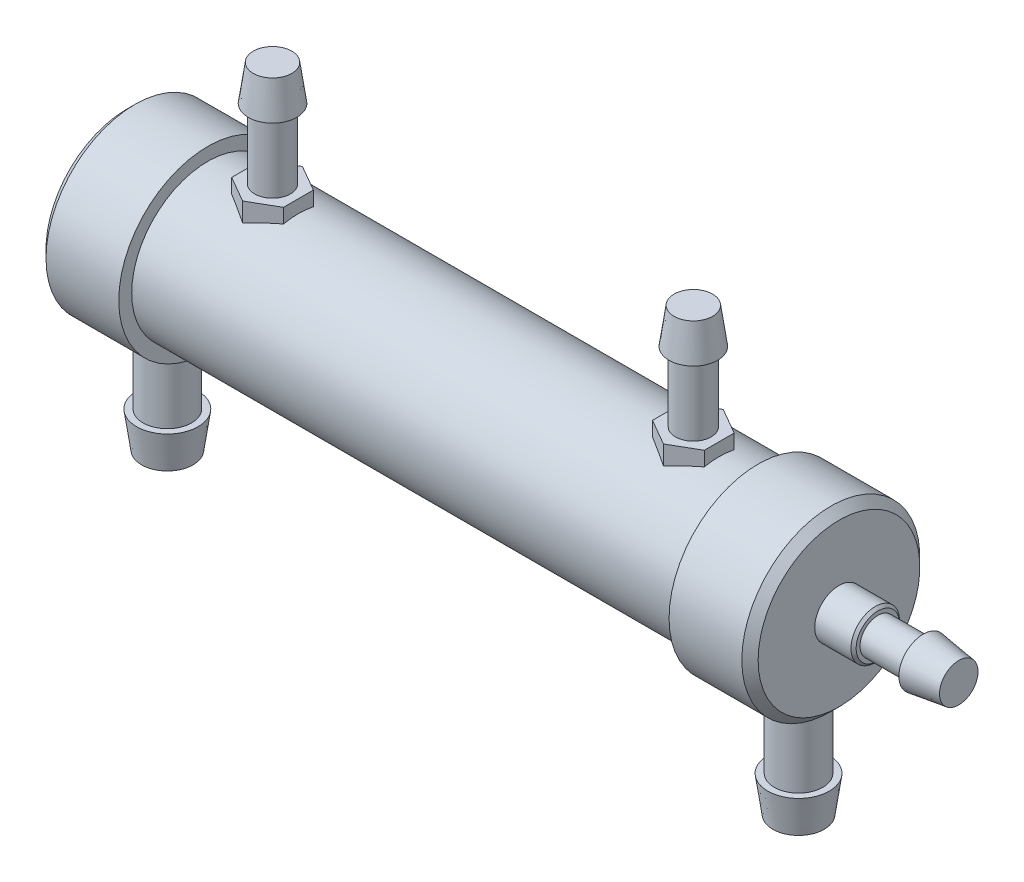
ISO-10303-21;
HEADER;
FILE_DESCRIPTION(('STEP AP214'),'2;1');
FILE_NAME('part.step','',(''),(''),'','','');
FILE_SCHEMA(('AUTOMOTIVE_DESIGN { 1 0 10303 214 1 1 1 1 }'));
ENDSEC;
DATA;
#1=APPLICATION_CONTEXT('core data for automotive mechanical design processes');
#2=APPLICATION_PROTOCOL_DEFINITION('international standard','automotive_design',2000,#1);
#3=PRODUCT_CONTEXT('',#1,'mechanical');
#4=PRODUCT('Part','Part','',(#3));
#5=PRODUCT_RELATED_PRODUCT_CATEGORY('part','',(#4));
#6=PRODUCT_DEFINITION_FORMATION('','',#4);
#7=PRODUCT_DEFINITION_CONTEXT('part definition',#1,'design');
#8=PRODUCT_DEFINITION('design','',#6,#7);
#9=PRODUCT_DEFINITION_SHAPE('','',#8);
#10=(LENGTH_UNIT() NAMED_UNIT(*) SI_UNIT(.MILLI.,.METRE.));
#11=(NAMED_UNIT(*) PLANE_ANGLE_UNIT() SI_UNIT($,.RADIAN.));
#12=(NAMED_UNIT(*) SI_UNIT($,.STERADIAN.) SOLID_ANGLE_UNIT());
#13=UNCERTAINTY_MEASURE_WITH_UNIT(LENGTH_MEASURE(1.E-05),#10,'distance_accuracy_value','');
#14=(GEOMETRIC_REPRESENTATION_CONTEXT(3) GLOBAL_UNCERTAINTY_ASSIGNED_CONTEXT((#13)) GLOBAL_UNIT_ASSIGNED_CONTEXT((#10,
#11,#12)) REPRESENTATION_CONTEXT('',''));
#15=CARTESIAN_POINT('',(0.,0.,0.));
#16=DIRECTION('',(0.,0.,1.));
#17=DIRECTION('',(1.,0.,0.));
#18=AXIS2_PLACEMENT_3D('',#15,#16,#17);
#19=CARTESIAN_POINT('',(111.125,14.9225,0.));
#20=DIRECTION('',(0.,1.,0.));
#21=DIRECTION('',(0.,0.,1.));
#22=AXIS2_PLACEMENT_3D('',#19,#20,#21);
#23=PLANE('',#22);
#24=CARTESIAN_POINT('',(111.125,14.9225,0.));
#25=DIRECTION('',(0.,1.,0.));
#26=DIRECTION('',(0.,0.,-1.));
#27=AXIS2_PLACEMENT_3D('',#24,#25,#26);
#28=CIRCLE('',#27,3.49249999999999);
#29=CARTESIAN_POINT('',(111.125,14.9225,-3.49249999999999));
#30=VERTEX_POINT('',#29);
#31=EDGE_CURVE('E11',#30,#30,#28,.T.);
#32=ORIENTED_EDGE('',*,*,#31,.F.);
#33=EDGE_LOOP('',(#32));
#34=FACE_BOUND('',#33,.T.);
#35=ADVANCED_FACE('F51',(#34),#23,.F.);
#36=CARTESIAN_POINT('',(111.125,-0.825209820916342,0.));
#37=DIRECTION('',(0.,-1.,0.));
#38=DIRECTION('',(0.,0.,-1.));
#39=AXIS2_PLACEMENT_3D('',#36,#37,#38);
#40=CYLINDRICAL_SURFACE('',#39,3.4925);
#41=ORIENTED_EDGE('',*,*,#31,.T.);
#42=EDGE_LOOP('',(#41));
#43=FACE_BOUND('',#42,.T.);
#44=CARTESIAN_POINT('',(111.125,31.115,0.));
#45=DIRECTION('',(0.,1.,0.));
#46=DIRECTION('',(0.,0.,-1.));
#47=AXIS2_PLACEMENT_3D('',#44,#45,#46);
#48=CIRCLE('',#47,3.4925);
#49=CARTESIAN_POINT('',(111.125,31.115,-3.4925));
#50=VERTEX_POINT('',#49);
#51=EDGE_CURVE('E57',#50,#50,#48,.T.);
#52=ORIENTED_EDGE('',*,*,#51,.F.);
#53=EDGE_LOOP('',(#52));
#54=FACE_BOUND('',#53,.T.);
#55=ADVANCED_FACE('F83',(#43,#54),#40,.T.);
#56=CARTESIAN_POINT('',(114.6175,31.115,0.));
#57=DIRECTION('',(0.,1.,0.));
#58=DIRECTION('',(0.,0.,1.));
#59=AXIS2_PLACEMENT_3D('',#56,#57,#58);
#60=PLANE('',#59);
#61=ORIENTED_EDGE('',*,*,#51,.T.);
#62=EDGE_LOOP('',(#61));
#63=FACE_BOUND('',#62,.T.);
#64=CARTESIAN_POINT('',(111.125,31.115,0.));
#65=DIRECTION('',(0.,1.,0.));
#66=DIRECTION('',(0.,0.,-1.));
#67=AXIS2_PLACEMENT_3D('',#64,#65,#66);
#68=CIRCLE('',#67,4.7625);
#69=CARTESIAN_POINT('',(111.125,31.115,-4.7625));
#70=VERTEX_POINT('',#69);
#71=EDGE_CURVE('E61',#70,#70,#68,.T.);
#72=ORIENTED_EDGE('',*,*,#71,.F.);
#73=EDGE_LOOP('',(#72));
#74=FACE_BOUND('',#73,.T.);
#75=ADVANCED_FACE('F75',(#63,#74),#60,.F.);
#76=CARTESIAN_POINT('',(111.125,38.1,0.));
#77=DIRECTION('',(0.,-1.,0.));
#78=DIRECTION('',(0.,0.,-1.));
#79=AXIS2_PLACEMENT_3D('',#76,#77,#78);
#80=CONICAL_SURFACE('',#79,3.78082226960379,0.139626340159547);
#81=ORIENTED_EDGE('',*,*,#71,.T.);
#82=EDGE_LOOP('',(#81));
#83=FACE_BOUND('',#82,.T.);
#84=CARTESIAN_POINT('',(111.125,38.1,0.));
#85=DIRECTION('',(0.,1.,0.));
#86=DIRECTION('',(0.,0.,-1.));
#87=AXIS2_PLACEMENT_3D('',#84,#85,#86);
#88=CIRCLE('',#87,3.78082226960379);
#89=CARTESIAN_POINT('',(111.125,38.1,-3.78082226960379));
#90=VERTEX_POINT('',#89);
#91=EDGE_CURVE('E65',#90,#90,#88,.T.);
#92=ORIENTED_EDGE('',*,*,#91,.F.);
#93=EDGE_LOOP('',(#92));
#94=FACE_BOUND('',#93,.T.);
#95=ADVANCED_FACE('F73',(#83,#94),#80,.T.);
#96=CARTESIAN_POINT('',(114.905822269604,38.1,0.));
#97=DIRECTION('',(0.,-1.,0.));
#98=DIRECTION('',(0.,0.,-1.));
#99=AXIS2_PLACEMENT_3D('',#96,#97,#98);
#100=PLANE('',#99);
#101=ORIENTED_EDGE('',*,*,#91,.T.);
#102=EDGE_LOOP('',(#101));
#103=FACE_BOUND('',#102,.T.);
#104=ADVANCED_FACE('F71',(#103),#100,.F.);
#105=CLOSED_SHELL('',(#35,#55,#75,#95,#104));
#106=MANIFOLD_SOLID_BREP('B2',#105);
#107=CARTESIAN_POINT('',(131.7625,-17.4624999999994,0.));
#108=DIRECTION('',(0.,-1.,0.));
#109=DIRECTION('',(-1.,0.,0.));
#110=AXIS2_PLACEMENT_3D('',#107,#108,#109);
#111=PLANE('',#110);
#112=CARTESIAN_POINT('',(131.7625,-17.4625000000013,0.));
#113=DIRECTION('',(0.,-1.,0.));
#114=DIRECTION('',(1.,0.,0.));
#115=AXIS2_PLACEMENT_3D('',#112,#113,#114);
#116=CIRCLE('',#115,4.7625);
#117=CARTESIAN_POINT('',(136.525,-17.4625000000013,0.));
#118=VERTEX_POINT('',#117);
#119=EDGE_CURVE('E50',#118,#118,#116,.T.);
#120=ORIENTED_EDGE('',*,*,#119,.F.);
#121=EDGE_LOOP('',(#120));
#122=FACE_BOUND('',#121,.T.);
#123=ADVANCED_FACE('F139',(#122),#111,.F.);
#124=CARTESIAN_POINT('',(131.7625,-0.261290096672001,0.));
#125=DIRECTION('',(0.,1.,0.));
#126=DIRECTION('',(1.,0.,0.));
#127=AXIS2_PLACEMENT_3D('',#124,#125,#126);
#128=CYLINDRICAL_SURFACE('',#127,4.7625);
#129=ORIENTED_EDGE('',*,*,#119,.T.);
#130=EDGE_LOOP('',(#129));
#131=FACE_BOUND('',#130,.T.);
#132=CARTESIAN_POINT('',(131.7625,-31.115,0.));
#133=DIRECTION('',(0.,-1.,0.));
#134=DIRECTION('',(1.,0.,0.));
#135=AXIS2_PLACEMENT_3D('',#132,#133,#134);
#136=CIRCLE('',#135,4.7625);
#137=CARTESIAN_POINT('',(136.525,-31.115,0.));
#138=VERTEX_POINT('',#137);
#139=EDGE_CURVE('E145',#138,#138,#136,.T.);
#140=ORIENTED_EDGE('',*,*,#139,.F.);
#141=EDGE_LOOP('',(#140));
#142=FACE_BOUND('',#141,.T.);
#143=ADVANCED_FACE('F171',(#131,#142),#128,.T.);
#144=CARTESIAN_POINT('',(127.,-31.115,0.));
#145=DIRECTION('',(0.,-1.,0.));
#146=DIRECTION('',(-1.,0.,0.));
#147=AXIS2_PLACEMENT_3D('',#144,#145,#146);
#148=PLANE('',#147);
#149=ORIENTED_EDGE('',*,*,#139,.T.);
#150=EDGE_LOOP('',(#149));
#151=FACE_BOUND('',#150,.T.);
#152=CARTESIAN_POINT('',(131.7625,-31.115,0.));
#153=DIRECTION('',(0.,-1.,0.));
#154=DIRECTION('',(1.,0.,0.));
#155=AXIS2_PLACEMENT_3D('',#152,#153,#154);
#156=CIRCLE('',#155,6.0325);
#157=CARTESIAN_POINT('',(137.795,-31.115,0.));
#158=VERTEX_POINT('',#157);
#159=EDGE_CURVE('E149',#158,#158,#156,.T.);
#160=ORIENTED_EDGE('',*,*,#159,.F.);
#161=EDGE_LOOP('',(#160));
#162=FACE_BOUND('',#161,.T.);
#163=ADVANCED_FACE('F163',(#151,#162),#148,.F.);
#164=CARTESIAN_POINT('',(131.7625,-38.1,0.));
#165=DIRECTION('',(0.,1.,0.));
#166=DIRECTION('',(1.,0.,0.));
#167=AXIS2_PLACEMENT_3D('',#164,#165,#166);
#168=CONICAL_SURFACE('',#167,5.05082226960382,0.139626340159543);
#169=ORIENTED_EDGE('',*,*,#159,.T.);
#170=EDGE_LOOP('',(#169));
#171=FACE_BOUND('',#170,.T.);
#172=CARTESIAN_POINT('',(131.7625,-38.1,0.));
#173=DIRECTION('',(0.,-1.,0.));
#174=DIRECTION('',(1.,0.,0.));
#175=AXIS2_PLACEMENT_3D('',#172,#173,#174);
#176=CIRCLE('',#175,5.05082226960382);
#177=CARTESIAN_POINT('',(136.813322269604,-38.1,0.));
#178=VERTEX_POINT('',#177);
#179=EDGE_CURVE('E153',#178,#178,#176,.T.);
#180=ORIENTED_EDGE('',*,*,#179,.F.);
#181=EDGE_LOOP('',(#180));
#182=FACE_BOUND('',#181,.T.);
#183=ADVANCED_FACE('F161',(#171,#182),#168,.T.);
#184=CARTESIAN_POINT('',(126.711677730396,-38.1,0.));
#185=DIRECTION('',(0.,1.,0.));
#186=DIRECTION('',(1.,0.,0.));
#187=AXIS2_PLACEMENT_3D('',#184,#185,#186);
#188=PLANE('',#187);
#189=ORIENTED_EDGE('',*,*,#179,.T.);
#190=EDGE_LOOP('',(#189));
#191=FACE_BOUND('',#190,.T.);
#192=ADVANCED_FACE('F159',(#191),#188,.F.);
#193=CLOSED_SHELL('',(#123,#143,#163,#183,#192));
#194=MANIFOLD_SOLID_BREP('B6',#193);
#195=CARTESIAN_POINT('',(7.9375,-17.4624999999994,0.));
#196=DIRECTION('',(0.,-1.,0.));
#197=DIRECTION('',(1.,0.,0.));
#198=AXIS2_PLACEMENT_3D('',#195,#196,#197);
#199=PLANE('',#198);
#200=CARTESIAN_POINT('',(7.9375,-17.4625000000013,0.));
#201=DIRECTION('',(0.,1.,0.));
#202=DIRECTION('',(-1.,0.,0.));
#203=AXIS2_PLACEMENT_3D('',#200,#201,#202);
#204=CIRCLE('',#203,4.7625);
#205=CARTESIAN_POINT('',(3.175,-17.4625000000013,0.));
#206=VERTEX_POINT('',#205);
#207=EDGE_CURVE('E138',#206,#206,#204,.T.);
#208=ORIENTED_EDGE('',*,*,#207,.T.);
#209=EDGE_LOOP('',(#208));
#210=FACE_BOUND('',#209,.T.);
#211=ADVANCED_FACE('F228',(#210),#199,.F.);
#212=CARTESIAN_POINT('',(7.9375,-0.261290096672001,0.));
#213=DIRECTION('',(0.,1.,0.));
#214=DIRECTION('',(-1.,0.,0.));
#215=AXIS2_PLACEMENT_3D('',#212,#213,#214);
#216=CYLINDRICAL_SURFACE('',#215,4.7625);
#217=ORIENTED_EDGE('',*,*,#207,.F.);
#218=EDGE_LOOP('',(#217));
#219=FACE_BOUND('',#218,.T.);
#220=CARTESIAN_POINT('',(7.9375,-31.115,0.));
#221=DIRECTION('',(0.,1.,0.));
#222=DIRECTION('',(-1.,0.,0.));
#223=AXIS2_PLACEMENT_3D('',#220,#221,#222);
#224=CIRCLE('',#223,4.7625);
#225=CARTESIAN_POINT('',(3.175,-31.115,0.));
#226=VERTEX_POINT('',#225);
#227=EDGE_CURVE('E234',#226,#226,#224,.T.);
#228=ORIENTED_EDGE('',*,*,#227,.T.);
#229=EDGE_LOOP('',(#228));
#230=FACE_BOUND('',#229,.T.);
#231=ADVANCED_FACE('F260',(#219,#230),#216,.T.);
#232=CARTESIAN_POINT('',(12.7,-31.115,0.));
#233=DIRECTION('',(0.,-1.,0.));
#234=DIRECTION('',(1.,0.,0.));
#235=AXIS2_PLACEMENT_3D('',#232,#233,#234);
#236=PLANE('',#235);
#237=ORIENTED_EDGE('',*,*,#227,.F.);
#238=EDGE_LOOP('',(#237));
#239=FACE_BOUND('',#238,.T.);
#240=CARTESIAN_POINT('',(7.9375,-31.115,0.));
#241=DIRECTION('',(0.,1.,0.));
#242=DIRECTION('',(-1.,0.,0.));
#243=AXIS2_PLACEMENT_3D('',#240,#241,#242);
#244=CIRCLE('',#243,6.0325);
#245=CARTESIAN_POINT('',(1.905,-31.115,0.));
#246=VERTEX_POINT('',#245);
#247=EDGE_CURVE('E238',#246,#246,#244,.T.);
#248=ORIENTED_EDGE('',*,*,#247,.T.);
#249=EDGE_LOOP('',(#248));
#250=FACE_BOUND('',#249,.T.);
#251=ADVANCED_FACE('F256',(#239,#250),#236,.F.);
#252=CARTESIAN_POINT('',(7.93750000000001,-38.1,0.));
#253=DIRECTION('',(0.,1.,0.));
#254=DIRECTION('',(-1.,0.,0.));
#255=AXIS2_PLACEMENT_3D('',#252,#253,#254);
#256=CONICAL_SURFACE('',#255,5.05082226960382,0.139626340159543);
#257=ORIENTED_EDGE('',*,*,#247,.F.);
#258=EDGE_LOOP('',(#257));
#259=FACE_BOUND('',#258,.T.);
#260=CARTESIAN_POINT('',(7.93750000000001,-38.1,0.));
#261=DIRECTION('',(0.,1.,0.));
#262=DIRECTION('',(-1.,0.,0.));
#263=AXIS2_PLACEMENT_3D('',#260,#261,#262);
#264=CIRCLE('',#263,5.05082226960382);
#265=CARTESIAN_POINT('',(2.88667773039618,-38.1,0.));
#266=VERTEX_POINT('',#265);
#267=EDGE_CURVE('E242',#266,#266,#264,.T.);
#268=ORIENTED_EDGE('',*,*,#267,.T.);
#269=EDGE_LOOP('',(#268));
#270=FACE_BOUND('',#269,.T.);
#271=ADVANCED_FACE('F248',(#259,#270),#256,.T.);
#272=CARTESIAN_POINT('',(12.9883222696038,-38.1,0.));
#273=DIRECTION('',(0.,1.,0.));
#274=DIRECTION('',(-1.,0.,0.));
#275=AXIS2_PLACEMENT_3D('',#272,#273,#274);
#276=PLANE('',#275);
#277=ORIENTED_EDGE('',*,*,#267,.F.);
#278=EDGE_LOOP('',(#277));
#279=FACE_BOUND('',#278,.T.);
#280=ADVANCED_FACE('F250',(#279),#276,.F.);
#281=CLOSED_SHELL('',(#211,#231,#251,#271,#280));
#282=MANIFOLD_SOLID_BREP('B45',#281);
#283=CARTESIAN_POINT('',(0.,0.,0.));
#284=DIRECTION('',(-1.,0.,0.));
#285=DIRECTION('',(0.,0.,1.));
#286=AXIS2_PLACEMENT_3D('',#283,#284,#285);
#287=CYLINDRICAL_SURFACE('',#286,14.9225);
#288=CARTESIAN_POINT('',(38.735,0.,0.));
#289=DIRECTION('',(-0.5,0.,-0.866025403784439));
#290=DIRECTION('',(-0.866025403784439,0.,0.5));
#291=AXIS2_PLACEMENT_3D('',#288,#289,#290);
#292=ELLIPSE('',#291,29.845,14.9225);
#293=CARTESIAN_POINT('',(28.575,13.7212416681825,5.8658787349666));
#294=VERTEX_POINT('',#293);
#295=CARTESIAN_POINT('',(33.655,14.6314344107701,2.9329393674833));
#296=VERTEX_POINT('',#295);
#297=EDGE_CURVE('E542',#294,#296,#292,.T.);
#298=ORIENTED_EDGE('',*,*,#297,.F.);
#299=CARTESIAN_POINT('',(18.415,0.,0.));
#300=DIRECTION('',(0.5,0.,-0.866025403784439));
#301=DIRECTION('',(-0.866025403784439,0.,-0.5));
#302=AXIS2_PLACEMENT_3D('',#299,#300,#301);
#303=ELLIPSE('',#302,29.845,14.9225);
#304=CARTESIAN_POINT('',(23.495,14.6314344107701,2.9329393674833));
#305=VERTEX_POINT('',#304);
#306=EDGE_CURVE('E522',#305,#294,#303,.T.);
#307=ORIENTED_EDGE('',*,*,#306,.F.);
#308=CARTESIAN_POINT('',(23.495,0.,0.));
#309=DIRECTION('',(1.,0.,0.));
#310=DIRECTION('',(0.,0.,-1.));
#311=AXIS2_PLACEMENT_3D('',#308,#309,#310);
#312=CIRCLE('',#311,14.9225);
#313=CARTESIAN_POINT('',(23.495,14.6314344107701,-2.9329393674833));
#314=VERTEX_POINT('',#313);
#315=EDGE_CURVE('E526',#314,#305,#312,.T.);
#316=ORIENTED_EDGE('',*,*,#315,.F.);
#317=CARTESIAN_POINT('',(18.415,0.,0.));
#318=DIRECTION('',(0.5,0.,0.866025403784439));
#319=DIRECTION('',(-0.866025403784439,0.,0.5));
#320=AXIS2_PLACEMENT_3D('',#317,#318,#319);
#321=ELLIPSE('',#320,29.845,14.9225);
#322=CARTESIAN_POINT('',(28.575,13.7212416681825,-5.8658787349666));
#323=VERTEX_POINT('',#322);
#324=EDGE_CURVE('E530',#323,#314,#321,.T.);
#325=ORIENTED_EDGE('',*,*,#324,.F.);
#326=CARTESIAN_POINT('',(38.735,0.,0.));
#327=DIRECTION('',(-0.5,0.,0.866025403784439));
#328=DIRECTION('',(-0.866025403784439,0.,-0.5));
#329=AXIS2_PLACEMENT_3D('',#326,#327,#328);
#330=ELLIPSE('',#329,29.845,14.9225);
#331=CARTESIAN_POINT('',(33.655,14.6314344107701,-2.9329393674833));
#332=VERTEX_POINT('',#331);
#333=EDGE_CURVE('E534',#332,#323,#330,.T.);
#334=ORIENTED_EDGE('',*,*,#333,.F.);
#335=CARTESIAN_POINT('',(33.655,0.,0.));
#336=DIRECTION('',(-1.,0.,0.));
#337=DIRECTION('',(0.,0.,1.));
#338=AXIS2_PLACEMENT_3D('',#335,#336,#337);
#339=CIRCLE('',#338,14.9225);
#340=EDGE_CURVE('E538',#296,#332,#339,.T.);
#341=ORIENTED_EDGE('',*,*,#340,.F.);
#342=EDGE_LOOP('',(#298,#307,#316,#325,#334,#341));
#343=FACE_BOUND('',#342,.T.);
#344=CARTESIAN_POINT('',(15.875,0.,0.));
#345=DIRECTION('',(-1.,0.,0.));
#346=DIRECTION('',(0.,0.,1.));
#347=AXIS2_PLACEMENT_3D('',#344,#345,#346);
#348=CIRCLE('',#347,14.9225);
#349=CARTESIAN_POINT('',(15.875,0.,14.9225));
#350=VERTEX_POINT('',#349);
#351=EDGE_CURVE('E514',#350,#350,#348,.T.);
#352=ORIENTED_EDGE('',*,*,#351,.F.);
#353=EDGE_LOOP('',(#352));
#354=FACE_BOUND('',#353,.T.);
#355=CARTESIAN_POINT('',(123.825,0.,0.));
#356=DIRECTION('',(-1.,0.,0.));
#357=DIRECTION('',(0.,0.,1.));
#358=AXIS2_PLACEMENT_3D('',#355,#356,#357);
#359=CIRCLE('',#358,14.9225);
#360=CARTESIAN_POINT('',(123.825,0.,14.9225));
#361=VERTEX_POINT('',#360);
#362=EDGE_CURVE('E510',#361,#361,#359,.T.);
#363=ORIENTED_EDGE('',*,*,#362,.T.);
#364=EDGE_LOOP('',(#363));
#365=FACE_BOUND('',#364,.T.);
#366=CARTESIAN_POINT('',(100.965,0.,0.));
#367=DIRECTION('',(0.499999999999996,0.,-0.866025403784441));
#368=DIRECTION('',(-0.866025403784441,0.,-0.499999999999996));
#369=AXIS2_PLACEMENT_3D('',#366,#367,#368);
#370=ELLIPSE('',#369,29.8450000000003,14.9225);
#371=CARTESIAN_POINT('',(106.045,14.6314344107701,2.93293936748336));
#372=VERTEX_POINT('',#371);
#373=CARTESIAN_POINT('',(111.125,13.7212416681825,5.8658787349666));
#374=VERTEX_POINT('',#373);
#375=EDGE_CURVE('E563',#372,#374,#370,.T.);
#376=ORIENTED_EDGE('',*,*,#375,.F.);
#377=CARTESIAN_POINT('',(106.045,0.,0.));
#378=DIRECTION('',(1.,0.,0.));
#379=DIRECTION('',(0.,0.,-1.));
#380=AXIS2_PLACEMENT_3D('',#377,#378,#379);
#381=CIRCLE('',#380,14.9225);
#382=CARTESIAN_POINT('',(106.045,14.6314344107701,-2.93293936748325));
#383=VERTEX_POINT('',#382);
#384=EDGE_CURVE('E414',#383,#372,#381,.T.);
#385=ORIENTED_EDGE('',*,*,#384,.F.);
#386=CARTESIAN_POINT('',(100.965,0.,0.));
#387=DIRECTION('',(0.500000000000007,0.,0.866025403784435));
#388=DIRECTION('',(-0.866025403784435,0.,0.500000000000007));
#389=AXIS2_PLACEMENT_3D('',#386,#387,#388);
#390=ELLIPSE('',#389,29.8449999999996,14.9225);
#391=CARTESIAN_POINT('',(111.125,13.7212416681825,-5.8658787349666));
#392=VERTEX_POINT('',#391);
#393=EDGE_CURVE('E551',#392,#383,#390,.T.);
#394=ORIENTED_EDGE('',*,*,#393,.F.);
#395=CARTESIAN_POINT('',(121.285,0.,0.));
#396=DIRECTION('',(-0.499999999999995,0.,0.866025403784442));
#397=DIRECTION('',(-0.866025403784442,0.,-0.499999999999995));
#398=AXIS2_PLACEMENT_3D('',#395,#396,#397);
#399=ELLIPSE('',#398,29.8450000000003,14.9225);
#400=CARTESIAN_POINT('',(116.205,14.6314344107701,-2.93293936748332));
#401=VERTEX_POINT('',#400);
#402=EDGE_CURVE('E555',#401,#392,#399,.T.);
#403=ORIENTED_EDGE('',*,*,#402,.F.);
#404=CARTESIAN_POINT('',(116.205,0.,0.));
#405=DIRECTION('',(-1.,0.,0.));
#406=DIRECTION('',(0.,0.,1.));
#407=AXIS2_PLACEMENT_3D('',#404,#405,#406);
#408=CIRCLE('',#407,14.9225);
#409=CARTESIAN_POINT('',(116.205,14.6314344107701,2.93293936748329));
#410=VERTEX_POINT('',#409);
#411=EDGE_CURVE('E330',#410,#401,#408,.T.);
#412=ORIENTED_EDGE('',*,*,#411,.F.);
#413=CARTESIAN_POINT('',(121.285,0.,0.));
#414=DIRECTION('',(-0.500000000000001,0.,-0.866025403784438));
#415=DIRECTION('',(-0.866025403784438,0.,0.500000000000001));
#416=AXIS2_PLACEMENT_3D('',#413,#414,#415);
#417=ELLIPSE('',#416,29.8449999999999,14.9225);
#418=EDGE_CURVE('E325',#374,#410,#417,.T.);
#419=ORIENTED_EDGE('',*,*,#418,.F.);
#420=EDGE_LOOP('',(#376,#385,#394,#403,#412,#419));
#421=FACE_BOUND('',#420,.T.);
#422=ADVANCED_FACE('F308',(#343,#354,#365,#421),#287,.T.);
#423=CARTESIAN_POINT('',(0.,0.,0.));
#424=DIRECTION('',(1.,0.,0.));
#425=DIRECTION('',(0.,0.,-1.));
#426=AXIS2_PLACEMENT_3D('',#423,#424,#425);
#427=PLANE('',#426);
#428=CARTESIAN_POINT('',(0.,0.,0.));
#429=DIRECTION('',(1.,0.,0.));
#430=DIRECTION('',(0.,0.,-1.));
#431=AXIS2_PLACEMENT_3D('',#428,#429,#430);
#432=CIRCLE('',#431,15.8623000000026);
#433=CARTESIAN_POINT('',(0.,0.,-15.8623000000026));
#434=VERTEX_POINT('',#433);
#435=EDGE_CURVE('E574',#434,#434,#432,.F.);
#436=ORIENTED_EDGE('',*,*,#435,.T.);
#437=EDGE_LOOP('',(#436));
#438=FACE_BOUND('',#437,.T.);
#439=ADVANCED_FACE('F598',(#438),#427,.F.);
#440=CARTESIAN_POINT('',(0.,0.,0.));
#441=DIRECTION('',(-1.,0.,0.));
#442=DIRECTION('',(0.,0.,1.));
#443=AXIS2_PLACEMENT_3D('',#440,#441,#442);
#444=CYLINDRICAL_SURFACE('',#443,17.4625000000013);
#445=CARTESIAN_POINT('',(1.60019999999871,0.,0.));
#446=DIRECTION('',(1.,0.,0.));
#447=DIRECTION('',(0.,0.,-1.));
#448=AXIS2_PLACEMENT_3D('',#445,#446,#447);
#449=CIRCLE('',#448,17.4625000000013);
#450=CARTESIAN_POINT('',(1.60019999999871,0.,-17.4625000000013));
#451=VERTEX_POINT('',#450);
#452=EDGE_CURVE('E578',#451,#451,#449,.T.);
#453=ORIENTED_EDGE('',*,*,#452,.T.);
#454=EDGE_LOOP('',(#453));
#455=FACE_BOUND('',#454,.T.);
#456=CARTESIAN_POINT('',(15.875,0.,0.));
#457=DIRECTION('',(-1.,0.,0.));
#458=DIRECTION('',(0.,0.,1.));
#459=AXIS2_PLACEMENT_3D('',#456,#457,#458);
#460=CIRCLE('',#459,17.4625);
#461=CARTESIAN_POINT('',(15.875,0.,17.4625));
#462=VERTEX_POINT('',#461);
#463=EDGE_CURVE('E518',#462,#462,#460,.T.);
#464=ORIENTED_EDGE('',*,*,#463,.T.);
#465=EDGE_LOOP('',(#464));
#466=FACE_BOUND('',#465,.T.);
#467=ADVANCED_FACE('F604',(#455,#466),#444,.T.);
#468=CARTESIAN_POINT('',(15.875,17.4625,0.));
#469=DIRECTION('',(-1.,0.,0.));
#470=DIRECTION('',(0.,0.,1.));
#471=AXIS2_PLACEMENT_3D('',#468,#469,#470);
#472=PLANE('',#471);
#473=ORIENTED_EDGE('',*,*,#463,.F.);
#474=EDGE_LOOP('',(#473));
#475=FACE_BOUND('',#474,.T.);
#476=ORIENTED_EDGE('',*,*,#351,.T.);
#477=EDGE_LOOP('',(#476));
#478=FACE_BOUND('',#477,.T.);
#479=ADVANCED_FACE('F612',(#475,#478),#472,.F.);
#480=CARTESIAN_POINT('',(123.825,14.9225,0.));
#481=DIRECTION('',(1.,0.,0.));
#482=DIRECTION('',(0.,0.,-1.));
#483=AXIS2_PLACEMENT_3D('',#480,#481,#482);
#484=PLANE('',#483);
#485=ORIENTED_EDGE('',*,*,#362,.F.);
#486=EDGE_LOOP('',(#485));
#487=FACE_BOUND('',#486,.T.);
#488=CARTESIAN_POINT('',(123.825,0.,0.));
#489=DIRECTION('',(-1.,0.,0.));
#490=DIRECTION('',(0.,0.,1.));
#491=AXIS2_PLACEMENT_3D('',#488,#489,#490);
#492=CIRCLE('',#491,17.4625);
#493=CARTESIAN_POINT('',(123.825,0.,17.4625));
#494=VERTEX_POINT('',#493);
#495=EDGE_CURVE('E506',#494,#494,#492,.T.);
#496=ORIENTED_EDGE('',*,*,#495,.T.);
#497=EDGE_LOOP('',(#496));
#498=FACE_BOUND('',#497,.T.);
#499=ADVANCED_FACE('F610',(#487,#498),#484,.F.);
#500=CARTESIAN_POINT('',(0.,0.,0.));
#501=DIRECTION('',(-1.,0.,0.));
#502=DIRECTION('',(0.,0.,1.));
#503=AXIS2_PLACEMENT_3D('',#500,#501,#502);
#504=CYLINDRICAL_SURFACE('',#503,17.4625);
#505=CARTESIAN_POINT('',(138.0998,0.,0.));
#506=DIRECTION('',(-1.,0.,0.));
#507=DIRECTION('',(0.,0.,1.));
#508=AXIS2_PLACEMENT_3D('',#505,#506,#507);
#509=CIRCLE('',#508,17.4625);
#510=CARTESIAN_POINT('',(138.0998,0.,17.4625));
#511=VERTEX_POINT('',#510);
#512=EDGE_CURVE('E566',#511,#511,#509,.T.);
#513=ORIENTED_EDGE('',*,*,#512,.T.);
#514=EDGE_LOOP('',(#513));
#515=FACE_BOUND('',#514,.T.);
#516=ORIENTED_EDGE('',*,*,#495,.F.);
#517=EDGE_LOOP('',(#516));
#518=FACE_BOUND('',#517,.T.);
#519=ADVANCED_FACE('F637',(#515,#518),#504,.T.);
#520=CARTESIAN_POINT('',(139.7,17.4625,0.));
#521=DIRECTION('',(-1.,0.,0.));
#522=DIRECTION('',(0.,0.,1.));
#523=AXIS2_PLACEMENT_3D('',#520,#521,#522);
#524=PLANE('',#523);
#525=CARTESIAN_POINT('',(139.7,0.,0.));
#526=DIRECTION('',(-1.,0.,0.));
#527=DIRECTION('',(0.,0.,1.));
#528=AXIS2_PLACEMENT_3D('',#525,#526,#527);
#529=CIRCLE('',#528,15.8623000000001);
#530=CARTESIAN_POINT('',(139.7,0.,15.8623000000001));
#531=VERTEX_POINT('',#530);
#532=EDGE_CURVE('E570',#531,#531,#529,.F.);
#533=ORIENTED_EDGE('',*,*,#532,.T.);
#534=EDGE_LOOP('',(#533));
#535=FACE_BOUND('',#534,.T.);
#536=CARTESIAN_POINT('',(139.7,0.,0.));
#537=DIRECTION('',(-1.,0.,0.));
#538=DIRECTION('',(0.,0.,1.));
#539=AXIS2_PLACEMENT_3D('',#536,#537,#538);
#540=CIRCLE('',#539,4.7625);
#541=CARTESIAN_POINT('',(139.7,0.,4.7625));
#542=VERTEX_POINT('',#541);
#543=EDGE_CURVE('E502',#542,#542,#540,.T.);
#544=ORIENTED_EDGE('',*,*,#543,.T.);
#545=EDGE_LOOP('',(#544));
#546=FACE_BOUND('',#545,.T.);
#547=ADVANCED_FACE('F640',(#535,#546),#524,.F.);
#548=CARTESIAN_POINT('',(0.,0.,0.));
#549=DIRECTION('',(-1.,0.,0.));
#550=DIRECTION('',(0.,0.,1.));
#551=AXIS2_PLACEMENT_3D('',#548,#549,#550);
#552=CYLINDRICAL_SURFACE('',#551,4.7625);
#553=CARTESIAN_POINT('',(146.812,0.,0.));
#554=DIRECTION('',(-1.,0.,0.));
#555=DIRECTION('',(0.,0.,1.));
#556=AXIS2_PLACEMENT_3D('',#553,#554,#555);
#557=CIRCLE('',#556,4.7625);
#558=CARTESIAN_POINT('',(146.812,0.,4.7625));
#559=VERTEX_POINT('',#558);
#560=EDGE_CURVE('E318',#559,#559,#557,.T.);
#561=ORIENTED_EDGE('',*,*,#560,.T.);
#562=EDGE_LOOP('',(#561));
#563=FACE_BOUND('',#562,.T.);
#564=ORIENTED_EDGE('',*,*,#543,.F.);
#565=EDGE_LOOP('',(#564));
#566=FACE_BOUND('',#565,.T.);
#567=ADVANCED_FACE('F585',(#563,#566),#552,.T.);
#568=CARTESIAN_POINT('',(147.32,4.7625,0.));
#569=DIRECTION('',(-1.,0.,0.));
#570=DIRECTION('',(0.,0.,1.));
#571=AXIS2_PLACEMENT_3D('',#568,#569,#570);
#572=PLANE('',#571);
#573=CARTESIAN_POINT('',(147.32,0.,0.));
#574=DIRECTION('',(-1.,0.,0.));
#575=DIRECTION('',(0.,0.,1.));
#576=AXIS2_PLACEMENT_3D('',#573,#574,#575);
#577=CIRCLE('',#576,4.25449999999998);
#578=CARTESIAN_POINT('',(147.32,0.,4.25449999999998));
#579=VERTEX_POINT('',#578);
#580=EDGE_CURVE('E226',#579,#579,#577,.F.);
#581=ORIENTED_EDGE('',*,*,#580,.T.);
#582=EDGE_LOOP('',(#581));
#583=FACE_BOUND('',#582,.T.);
#584=CARTESIAN_POINT('',(147.32,0.,0.));
#585=DIRECTION('',(-1.,0.,0.));
#586=DIRECTION('',(0.,0.,1.));
#587=AXIS2_PLACEMENT_3D('',#584,#585,#586);
#588=CIRCLE('',#587,3.4925);
#589=CARTESIAN_POINT('',(147.32,0.,3.4925));
#590=VERTEX_POINT('',#589);
#591=EDGE_CURVE('E498',#590,#590,#588,.T.);
#592=ORIENTED_EDGE('',*,*,#591,.T.);
#593=EDGE_LOOP('',(#592));
#594=FACE_BOUND('',#593,.T.);
#595=ADVANCED_FACE('F753',(#583,#594),#572,.F.);
#596=CARTESIAN_POINT('',(0.,0.,0.));
#597=DIRECTION('',(-1.,0.,0.));
#598=DIRECTION('',(0.,0.,1.));
#599=AXIS2_PLACEMENT_3D('',#596,#597,#598);
#600=CYLINDRICAL_SURFACE('',#599,3.4925);
#601=ORIENTED_EDGE('',*,*,#591,.F.);
#602=EDGE_LOOP('',(#601));
#603=FACE_BOUND('',#602,.T.);
#604=CARTESIAN_POINT('',(156.21,0.,0.));
#605=DIRECTION('',(-1.,0.,0.));
#606=DIRECTION('',(0.,0.,1.));
#607=AXIS2_PLACEMENT_3D('',#604,#605,#606);
#608=CIRCLE('',#607,3.4925);
#609=CARTESIAN_POINT('',(156.21,0.,3.4925));
#610=VERTEX_POINT('',#609);
#611=EDGE_CURVE('E494',#610,#610,#608,.T.);
#612=ORIENTED_EDGE('',*,*,#611,.T.);
#613=EDGE_LOOP('',(#612));
#614=FACE_BOUND('',#613,.T.);
#615=ADVANCED_FACE('F749',(#603,#614),#600,.T.);
#616=CARTESIAN_POINT('',(156.21,3.4925,0.));
#617=DIRECTION('',(1.,0.,0.));
#618=DIRECTION('',(0.,0.,-1.));
#619=AXIS2_PLACEMENT_3D('',#616,#617,#618);
#620=PLANE('',#619);
#621=ORIENTED_EDGE('',*,*,#611,.F.);
#622=EDGE_LOOP('',(#621));
#623=FACE_BOUND('',#622,.T.);
#624=CARTESIAN_POINT('',(156.21,0.,0.));
#625=DIRECTION('',(-1.,0.,0.));
#626=DIRECTION('',(0.,0.,1.));
#627=AXIS2_PLACEMENT_3D('',#624,#625,#626);
#628=CIRCLE('',#627,4.7625);
#629=CARTESIAN_POINT('',(156.21,0.,4.7625));
#630=VERTEX_POINT('',#629);
#631=EDGE_CURVE('E490',#630,#630,#628,.T.);
#632=ORIENTED_EDGE('',*,*,#631,.T.);
#633=EDGE_LOOP('',(#632));
#634=FACE_BOUND('',#633,.T.);
#635=ADVANCED_FACE('F745',(#623,#634),#620,.F.);
#636=CARTESIAN_POINT('',(163.195,0.,0.));
#637=DIRECTION('',(-1.,0.,0.));
#638=DIRECTION('',(0.,0.,1.));
#639=AXIS2_PLACEMENT_3D('',#636,#637,#638);
#640=CONICAL_SURFACE('',#639,3.78082226960385,0.13962634015954);
#641=ORIENTED_EDGE('',*,*,#631,.F.);
#642=EDGE_LOOP('',(#641));
#643=FACE_BOUND('',#642,.T.);
#644=CARTESIAN_POINT('',(163.195,0.,0.));
#645=DIRECTION('',(-1.,0.,0.));
#646=DIRECTION('',(0.,0.,1.));
#647=AXIS2_PLACEMENT_3D('',#644,#645,#646);
#648=CIRCLE('',#647,3.78082226960385);
#649=CARTESIAN_POINT('',(163.195,0.,3.78082226960385));
#650=VERTEX_POINT('',#649);
#651=EDGE_CURVE('E486',#650,#650,#648,.T.);
#652=ORIENTED_EDGE('',*,*,#651,.T.);
#653=EDGE_LOOP('',(#652));
#654=FACE_BOUND('',#653,.T.);
#655=ADVANCED_FACE('F741',(#643,#654),#640,.T.);
#656=CARTESIAN_POINT('',(163.195,3.78082226960385,0.));
#657=DIRECTION('',(-1.,0.,0.));
#658=DIRECTION('',(0.,0.,1.));
#659=AXIS2_PLACEMENT_3D('',#656,#657,#658);
#660=PLANE('',#659);
#661=ORIENTED_EDGE('',*,*,#651,.F.);
#662=EDGE_LOOP('',(#661));
#663=FACE_BOUND('',#662,.T.);
#664=ADVANCED_FACE('F737',(#663),#660,.F.);
#665=CARTESIAN_POINT('',(28.575,17.4625,5.8658787349666));
#666=DIRECTION('',(-0.5,0.,-0.866025403784439));
#667=DIRECTION('',(-0.866025403784439,0.,0.5));
#668=AXIS2_PLACEMENT_3D('',#665,#666,#667);
#669=PLANE('',#668);
#670=DIRECTION('',(0.,-1.,0.));
#671=VECTOR('',#670,1.);
#672=CARTESIAN_POINT('',(28.575,17.4625,5.8658787349666));
#673=LINE('',#672,#671);
#674=CARTESIAN_POINT('',(28.575,17.4625,5.8658787349666));
#675=VERTEX_POINT('',#674);
#676=EDGE_CURVE('E462',#675,#294,#673,.T.);
#677=ORIENTED_EDGE('',*,*,#676,.T.);
#678=ORIENTED_EDGE('',*,*,#297,.T.);
#679=DIRECTION('',(0.,-1.,0.));
#680=VECTOR('',#679,1.);
#681=CARTESIAN_POINT('',(33.655,17.4625,2.9329393674833));
#682=LINE('',#681,#680);
#683=CARTESIAN_POINT('',(33.655,17.4625,2.9329393674833));
#684=VERTEX_POINT('',#683);
#685=EDGE_CURVE('E482',#684,#296,#682,.T.);
#686=ORIENTED_EDGE('',*,*,#685,.F.);
#687=DIRECTION('',(0.866025403784438,0.,-0.5));
#688=VECTOR('',#687,1.);
#689=CARTESIAN_POINT('',(28.575,17.4625,5.8658787349666));
#690=LINE('',#689,#688);
#691=EDGE_CURVE('E443',#675,#684,#690,.T.);
#692=ORIENTED_EDGE('',*,*,#691,.F.);
#693=EDGE_LOOP('',(#677,#678,#686,#692));
#694=FACE_BOUND('',#693,.T.);
#695=ADVANCED_FACE('F733',(#694),#669,.F.);
#696=CARTESIAN_POINT('',(33.655,17.4625,2.9329393674833));
#697=DIRECTION('',(-1.,0.,0.));
#698=DIRECTION('',(0.,0.,1.));
#699=AXIS2_PLACEMENT_3D('',#696,#697,#698);
#700=PLANE('',#699);
#701=ORIENTED_EDGE('',*,*,#685,.T.);
#702=ORIENTED_EDGE('',*,*,#340,.T.);
#703=DIRECTION('',(0.,-1.,0.));
#704=VECTOR('',#703,1.);
#705=CARTESIAN_POINT('',(33.655,17.4625,-2.9329393674833));
#706=LINE('',#705,#704);
#707=CARTESIAN_POINT('',(33.655,17.4625,-2.9329393674833));
#708=VERTEX_POINT('',#707);
#709=EDGE_CURVE('E478',#708,#332,#706,.T.);
#710=ORIENTED_EDGE('',*,*,#709,.F.);
#711=DIRECTION('',(0.,0.,-1.));
#712=VECTOR('',#711,1.);
#713=CARTESIAN_POINT('',(33.655,17.4625,2.9329393674833));
#714=LINE('',#713,#712);
#715=EDGE_CURVE('E447',#684,#708,#714,.T.);
#716=ORIENTED_EDGE('',*,*,#715,.F.);
#717=EDGE_LOOP('',(#701,#702,#710,#716));
#718=FACE_BOUND('',#717,.T.);
#719=ADVANCED_FACE('F729',(#718),#700,.F.);
#720=CARTESIAN_POINT('',(33.655,17.4625,-2.9329393674833));
#721=DIRECTION('',(-0.5,0.,0.866025403784439));
#722=DIRECTION('',(0.866025403784439,0.,0.5));
#723=AXIS2_PLACEMENT_3D('',#720,#721,#722);
#724=PLANE('',#723);
#725=ORIENTED_EDGE('',*,*,#709,.T.);
#726=ORIENTED_EDGE('',*,*,#333,.T.);
#727=DIRECTION('',(0.,-1.,0.));
#728=VECTOR('',#727,1.);
#729=CARTESIAN_POINT('',(28.575,17.4625,-5.8658787349666));
#730=LINE('',#729,#728);
#731=CARTESIAN_POINT('',(28.575,17.4625,-5.8658787349666));
#732=VERTEX_POINT('',#731);
#733=EDGE_CURVE('E474',#732,#323,#730,.T.);
#734=ORIENTED_EDGE('',*,*,#733,.F.);
#735=DIRECTION('',(-0.866025403784439,0.,-0.5));
#736=VECTOR('',#735,1.);
#737=CARTESIAN_POINT('',(33.655,17.4625,-2.9329393674833));
#738=LINE('',#737,#736);
#739=EDGE_CURVE('E450',#708,#732,#738,.T.);
#740=ORIENTED_EDGE('',*,*,#739,.F.);
#741=EDGE_LOOP('',(#725,#726,#734,#740));
#742=FACE_BOUND('',#741,.T.);
#743=ADVANCED_FACE('F725',(#742),#724,.F.);
#744=CARTESIAN_POINT('',(28.575,17.4625,-5.8658787349666));
#745=DIRECTION('',(0.5,0.,0.866025403784439));
#746=DIRECTION('',(0.866025403784439,0.,-0.5));
#747=AXIS2_PLACEMENT_3D('',#744,#745,#746);
#748=PLANE('',#747);
#749=ORIENTED_EDGE('',*,*,#733,.T.);
#750=ORIENTED_EDGE('',*,*,#324,.T.);
#751=DIRECTION('',(0.,-1.,0.));
#752=VECTOR('',#751,1.);
#753=CARTESIAN_POINT('',(23.495,17.4625,-2.9329393674833));
#754=LINE('',#753,#752);
#755=CARTESIAN_POINT('',(23.495,17.4625,-2.9329393674833));
#756=VERTEX_POINT('',#755);
#757=EDGE_CURVE('E470',#756,#314,#754,.T.);
#758=ORIENTED_EDGE('',*,*,#757,.F.);
#759=DIRECTION('',(-0.866025403784439,0.,0.5));
#760=VECTOR('',#759,1.);
#761=CARTESIAN_POINT('',(28.575,17.4625,-5.8658787349666));
#762=LINE('',#761,#760);
#763=EDGE_CURVE('E453',#732,#756,#762,.T.);
#764=ORIENTED_EDGE('',*,*,#763,.F.);
#765=EDGE_LOOP('',(#749,#750,#758,#764));
#766=FACE_BOUND('',#765,.T.);
#767=ADVANCED_FACE('F721',(#766),#748,.F.);
#768=CARTESIAN_POINT('',(23.495,17.4625,-2.9329393674833));
#769=DIRECTION('',(1.,0.,0.));
#770=DIRECTION('',(0.,0.,-1.));
#771=AXIS2_PLACEMENT_3D('',#768,#769,#770);
#772=PLANE('',#771);
#773=ORIENTED_EDGE('',*,*,#757,.T.);
#774=ORIENTED_EDGE('',*,*,#315,.T.);
#775=DIRECTION('',(0.,-1.,0.));
#776=VECTOR('',#775,1.);
#777=CARTESIAN_POINT('',(23.495,17.4625,2.9329393674833));
#778=LINE('',#777,#776);
#779=CARTESIAN_POINT('',(23.495,17.4625,2.9329393674833));
#780=VERTEX_POINT('',#779);
#781=EDGE_CURVE('E466',#780,#305,#778,.T.);
#782=ORIENTED_EDGE('',*,*,#781,.F.);
#783=DIRECTION('',(0.,0.,1.));
#784=VECTOR('',#783,1.);
#785=CARTESIAN_POINT('',(23.495,17.4625,-2.9329393674833));
#786=LINE('',#785,#784);
#787=EDGE_CURVE('E456',#756,#780,#786,.T.);
#788=ORIENTED_EDGE('',*,*,#787,.F.);
#789=EDGE_LOOP('',(#773,#774,#782,#788));
#790=FACE_BOUND('',#789,.T.);
#791=ADVANCED_FACE('F717',(#790),#772,.F.);
#792=CARTESIAN_POINT('',(23.495,17.4625,2.9329393674833));
#793=DIRECTION('',(0.5,0.,-0.866025403784439));
#794=DIRECTION('',(-0.866025403784439,0.,-0.5));
#795=AXIS2_PLACEMENT_3D('',#792,#793,#794);
#796=PLANE('',#795);
#797=ORIENTED_EDGE('',*,*,#781,.T.);
#798=ORIENTED_EDGE('',*,*,#306,.T.);
#799=ORIENTED_EDGE('',*,*,#676,.F.);
#800=DIRECTION('',(0.866025403784439,0.,0.5));
#801=VECTOR('',#800,1.);
#802=CARTESIAN_POINT('',(23.495,17.4625,2.9329393674833));
#803=LINE('',#802,#801);
#804=EDGE_CURVE('E459',#780,#675,#803,.T.);
#805=ORIENTED_EDGE('',*,*,#804,.F.);
#806=EDGE_LOOP('',(#797,#798,#799,#805));
#807=FACE_BOUND('',#806,.T.);
#808=ADVANCED_FACE('F713',(#807),#796,.F.);
#809=CARTESIAN_POINT('',(0.,17.4625,0.));
#810=DIRECTION('',(0.,1.,0.));
#811=DIRECTION('',(0.,0.,1.));
#812=AXIS2_PLACEMENT_3D('',#809,#810,#811);
#813=PLANE('',#812);
#814=CARTESIAN_POINT('',(28.575,17.4625,0.));
#815=DIRECTION('',(0.,1.,0.));
#816=DIRECTION('',(0.,0.,1.));
#817=AXIS2_PLACEMENT_3D('',#814,#815,#816);
#818=CIRCLE('',#817,3.4925);
#819=CARTESIAN_POINT('',(28.575,17.4625,3.4925));
#820=VERTEX_POINT('',#819);
#821=EDGE_CURVE('E442',#820,#820,#818,.F.);
#822=ORIENTED_EDGE('',*,*,#821,.T.);
#823=EDGE_LOOP('',(#822));
#824=FACE_BOUND('',#823,.T.);
#825=ORIENTED_EDGE('',*,*,#691,.T.);
#826=ORIENTED_EDGE('',*,*,#715,.T.);
#827=ORIENTED_EDGE('',*,*,#739,.T.);
#828=ORIENTED_EDGE('',*,*,#763,.T.);
#829=ORIENTED_EDGE('',*,*,#787,.T.);
#830=ORIENTED_EDGE('',*,*,#804,.T.);
#831=EDGE_LOOP('',(#825,#826,#827,#828,#829,#830));
#832=FACE_BOUND('',#831,.T.);
#833=ADVANCED_FACE('F709',(#824,#832),#813,.T.);
#834=CARTESIAN_POINT('',(28.575,-0.825209820916342,0.));
#835=DIRECTION('',(0.,-1.,0.));
#836=DIRECTION('',(0.,0.,-1.));
#837=AXIS2_PLACEMENT_3D('',#834,#835,#836);
#838=CYLINDRICAL_SURFACE('',#837,3.4925);
#839=ORIENTED_EDGE('',*,*,#821,.F.);
#840=EDGE_LOOP('',(#839));
#841=FACE_BOUND('',#840,.T.);
#842=CARTESIAN_POINT('',(28.575,31.115,0.));
#843=DIRECTION('',(0.,-1.,0.));
#844=DIRECTION('',(0.,0.,-1.));
#845=AXIS2_PLACEMENT_3D('',#842,#843,#844);
#846=CIRCLE('',#845,3.4925);
#847=CARTESIAN_POINT('',(28.575,31.115,-3.4925));
#848=VERTEX_POINT('',#847);
#849=EDGE_CURVE('E438',#848,#848,#846,.T.);
#850=ORIENTED_EDGE('',*,*,#849,.T.);
#851=EDGE_LOOP('',(#850));
#852=FACE_BOUND('',#851,.T.);
#853=ADVANCED_FACE('F705',(#841,#852),#838,.T.);
#854=CARTESIAN_POINT('',(25.0825,31.115,0.));
#855=DIRECTION('',(0.,1.,0.));
#856=DIRECTION('',(0.,0.,1.));
#857=AXIS2_PLACEMENT_3D('',#854,#855,#856);
#858=PLANE('',#857);
#859=ORIENTED_EDGE('',*,*,#849,.F.);
#860=EDGE_LOOP('',(#859));
#861=FACE_BOUND('',#860,.T.);
#862=CARTESIAN_POINT('',(28.575,31.115,0.));
#863=DIRECTION('',(0.,-1.,0.));
#864=DIRECTION('',(0.,0.,-1.));
#865=AXIS2_PLACEMENT_3D('',#862,#863,#864);
#866=CIRCLE('',#865,4.7625);
#867=CARTESIAN_POINT('',(28.575,31.115,-4.7625));
#868=VERTEX_POINT('',#867);
#869=EDGE_CURVE('E429',#868,#868,#866,.T.);
#870=ORIENTED_EDGE('',*,*,#869,.T.);
#871=EDGE_LOOP('',(#870));
#872=FACE_BOUND('',#871,.T.);
#873=ADVANCED_FACE('F701',(#861,#872),#858,.F.);
#874=CARTESIAN_POINT('',(28.575,38.1,0.));
#875=DIRECTION('',(0.,-1.,0.));
#876=DIRECTION('',(0.,0.,-1.));
#877=AXIS2_PLACEMENT_3D('',#874,#875,#876);
#878=CONICAL_SURFACE('',#877,3.78082226960379,0.139626340159547);
#879=ORIENTED_EDGE('',*,*,#869,.F.);
#880=EDGE_LOOP('',(#879));
#881=FACE_BOUND('',#880,.T.);
#882=CARTESIAN_POINT('',(28.575,38.1,0.));
#883=DIRECTION('',(0.,-1.,0.));
#884=DIRECTION('',(0.,0.,-1.));
#885=AXIS2_PLACEMENT_3D('',#882,#883,#884);
#886=CIRCLE('',#885,3.78082226960379);
#887=CARTESIAN_POINT('',(28.575,38.1,-3.78082226960379));
#888=VERTEX_POINT('',#887);
#889=EDGE_CURVE('E423',#888,#888,#886,.T.);
#890=ORIENTED_EDGE('',*,*,#889,.T.);
#891=EDGE_LOOP('',(#890));
#892=FACE_BOUND('',#891,.T.);
#893=ADVANCED_FACE('F697',(#881,#892),#878,.T.);
#894=CARTESIAN_POINT('',(24.7941777303962,38.1,0.));
#895=DIRECTION('',(0.,-1.,0.));
#896=DIRECTION('',(0.,0.,-1.));
#897=AXIS2_PLACEMENT_3D('',#894,#895,#896);
#898=PLANE('',#897);
#899=ORIENTED_EDGE('',*,*,#889,.F.);
#900=EDGE_LOOP('',(#899));
#901=FACE_BOUND('',#900,.T.);
#902=ADVANCED_FACE('F694',(#901),#898,.F.);
#903=CARTESIAN_POINT('',(106.045,17.4625,2.93293936748336));
#904=DIRECTION('',(0.499999999999996,0.,-0.866025403784441));
#905=DIRECTION('',(-0.866025403784441,0.,-0.499999999999996));
#906=AXIS2_PLACEMENT_3D('',#903,#904,#905);
#907=PLANE('',#906);
#908=DIRECTION('',(0.,-1.,0.));
#909=VECTOR('',#908,1.);
#910=CARTESIAN_POINT('',(106.045,17.4625,2.93293936748336));
#911=LINE('',#910,#909);
#912=CARTESIAN_POINT('',(106.045,17.4625,2.93293936748336));
#913=VERTEX_POINT('',#912);
#914=EDGE_CURVE('E409',#913,#372,#911,.T.);
#915=ORIENTED_EDGE('',*,*,#914,.T.);
#916=ORIENTED_EDGE('',*,*,#375,.T.);
#917=DIRECTION('',(0.,-1.,0.));
#918=VECTOR('',#917,1.);
#919=CARTESIAN_POINT('',(111.125,17.4625,5.8658787349666));
#920=LINE('',#919,#918);
#921=CARTESIAN_POINT('',(111.125,17.4625,5.8658787349666));
#922=VERTEX_POINT('',#921);
#923=EDGE_CURVE('E421',#922,#374,#920,.T.);
#924=ORIENTED_EDGE('',*,*,#923,.F.);
#925=DIRECTION('',(0.866025403784441,0.,0.499999999999996));
#926=VECTOR('',#925,1.);
#927=CARTESIAN_POINT('',(106.045,17.4625,2.93293936748336));
#928=LINE('',#927,#926);
#929=EDGE_CURVE('E401',#913,#922,#928,.T.);
#930=ORIENTED_EDGE('',*,*,#929,.F.);
#931=EDGE_LOOP('',(#915,#916,#924,#930));
#932=FACE_BOUND('',#931,.T.);
#933=ADVANCED_FACE('F419',(#932),#907,.F.);
#934=CARTESIAN_POINT('',(111.125,17.4625,5.8658787349666));
#935=DIRECTION('',(-0.500000000000001,0.,-0.866025403784438));
#936=DIRECTION('',(-0.866025403784438,0.,0.500000000000001));
#937=AXIS2_PLACEMENT_3D('',#934,#935,#936);
#938=PLANE('',#937);
#939=ORIENTED_EDGE('',*,*,#923,.T.);
#940=ORIENTED_EDGE('',*,*,#418,.T.);
#941=DIRECTION('',(0.,-1.,0.));
#942=VECTOR('',#941,1.);
#943=CARTESIAN_POINT('',(116.205,17.4625,2.93293936748329));
#944=LINE('',#943,#942);
#945=CARTESIAN_POINT('',(116.205,17.4625,2.93293936748329));
#946=VERTEX_POINT('',#945);
#947=EDGE_CURVE('E654',#946,#410,#944,.T.);
#948=ORIENTED_EDGE('',*,*,#947,.F.);
#949=DIRECTION('',(0.866025403784438,0.,-0.500000000000002));
#950=VECTOR('',#949,1.);
#951=CARTESIAN_POINT('',(111.125,17.4625,5.8658787349666));
#952=LINE('',#951,#950);
#953=EDGE_CURVE('E424',#922,#946,#952,.T.);
#954=ORIENTED_EDGE('',*,*,#953,.F.);
#955=EDGE_LOOP('',(#939,#940,#948,#954));
#956=FACE_BOUND('',#955,.T.);
#957=ADVANCED_FACE('F650',(#956),#938,.F.);
#958=CARTESIAN_POINT('',(116.205,17.4625,2.93293936748329));
#959=DIRECTION('',(-1.,0.,0.));
#960=DIRECTION('',(0.,0.,1.));
#961=AXIS2_PLACEMENT_3D('',#958,#959,#960);
#962=PLANE('',#961);
#963=ORIENTED_EDGE('',*,*,#947,.T.);
#964=ORIENTED_EDGE('',*,*,#411,.T.);
#965=DIRECTION('',(0.,-1.,0.));
#966=VECTOR('',#965,1.);
#967=CARTESIAN_POINT('',(116.205,17.4625,-2.93293936748332));
#968=LINE('',#967,#966);
#969=CARTESIAN_POINT('',(116.205,17.4625,-2.93293936748332));
#970=VERTEX_POINT('',#969);
#971=EDGE_CURVE('E657',#970,#401,#968,.T.);
#972=ORIENTED_EDGE('',*,*,#971,.F.);
#973=DIRECTION('',(0.,0.,-1.));
#974=VECTOR('',#973,1.);
#975=CARTESIAN_POINT('',(116.205,17.4625,2.93293936748329));
#976=LINE('',#975,#974);
#977=EDGE_CURVE('E431',#946,#970,#976,.T.);
#978=ORIENTED_EDGE('',*,*,#977,.F.);
#979=EDGE_LOOP('',(#963,#964,#972,#978));
#980=FACE_BOUND('',#979,.T.);
#981=ADVANCED_FACE('F679',(#980),#962,.F.);
#982=CARTESIAN_POINT('',(116.205,17.4625,-2.93293936748332));
#983=DIRECTION('',(-0.499999999999995,0.,0.866025403784442));
#984=DIRECTION('',(0.866025403784442,0.,0.499999999999995));
#985=AXIS2_PLACEMENT_3D('',#982,#983,#984);
#986=PLANE('',#985);
#987=ORIENTED_EDGE('',*,*,#971,.T.);
#988=ORIENTED_EDGE('',*,*,#402,.T.);
#989=DIRECTION('',(0.,-1.,0.));
#990=VECTOR('',#989,1.);
#991=CARTESIAN_POINT('',(111.125,17.4625,-5.8658787349666));
#992=LINE('',#991,#990);
#993=CARTESIAN_POINT('',(111.125,17.4625,-5.8658787349666));
#994=VERTEX_POINT('',#993);
#995=EDGE_CURVE('E663',#994,#392,#992,.T.);
#996=ORIENTED_EDGE('',*,*,#995,.F.);
#997=DIRECTION('',(-0.866025403784442,0.,-0.499999999999995));
#998=VECTOR('',#997,1.);
#999=CARTESIAN_POINT('',(116.205,17.4625,-2.93293936748332));
#1000=LINE('',#999,#998);
#1001=EDGE_CURVE('E671',#970,#994,#1000,.T.);
#1002=ORIENTED_EDGE('',*,*,#1001,.F.);
#1003=EDGE_LOOP('',(#987,#988,#996,#1002));
#1004=FACE_BOUND('',#1003,.T.);
#1005=ADVANCED_FACE('F681',(#1004),#986,.F.);
#1006=CARTESIAN_POINT('',(111.125,17.4625,-5.8658787349666));
#1007=DIRECTION('',(0.500000000000007,0.,0.866025403784435));
#1008=DIRECTION('',(0.866025403784435,0.,-0.500000000000007));
#1009=AXIS2_PLACEMENT_3D('',#1006,#1007,#1008);
#1010=PLANE('',#1009);
#1011=ORIENTED_EDGE('',*,*,#995,.T.);
#1012=ORIENTED_EDGE('',*,*,#393,.T.);
#1013=DIRECTION('',(0.,-1.,0.));
#1014=VECTOR('',#1013,1.);
#1015=CARTESIAN_POINT('',(106.045,17.4625,-2.93293936748325));
#1016=LINE('',#1015,#1014);
#1017=CARTESIAN_POINT('',(106.045,17.4625,-2.93293936748325));
#1018=VERTEX_POINT('',#1017);
#1019=EDGE_CURVE('E417',#1018,#383,#1016,.T.);
#1020=ORIENTED_EDGE('',*,*,#1019,.F.);
#1021=DIRECTION('',(-0.866025403784434,0.,0.500000000000007));
#1022=VECTOR('',#1021,1.);
#1023=CARTESIAN_POINT('',(111.125,17.4625,-5.8658787349666));
#1024=LINE('',#1023,#1022);
#1025=EDGE_CURVE('E404',#994,#1018,#1024,.T.);
#1026=ORIENTED_EDGE('',*,*,#1025,.F.);
#1027=EDGE_LOOP('',(#1011,#1012,#1020,#1026));
#1028=FACE_BOUND('',#1027,.T.);
#1029=ADVANCED_FACE('F683',(#1028),#1010,.F.);
#1030=CARTESIAN_POINT('',(106.045,17.4625,-2.93293936748325));
#1031=DIRECTION('',(1.,0.,0.));
#1032=DIRECTION('',(0.,0.,-1.));
#1033=AXIS2_PLACEMENT_3D('',#1030,#1031,#1032);
#1034=PLANE('',#1033);
#1035=ORIENTED_EDGE('',*,*,#1019,.T.);
#1036=ORIENTED_EDGE('',*,*,#384,.T.);
#1037=ORIENTED_EDGE('',*,*,#914,.F.);
#1038=DIRECTION('',(0.,0.,1.));
#1039=VECTOR('',#1038,1.);
#1040=CARTESIAN_POINT('',(106.045,17.4625,-2.93293936748325));
#1041=LINE('',#1040,#1039);
#1042=EDGE_CURVE('E397',#1018,#913,#1041,.T.);
#1043=ORIENTED_EDGE('',*,*,#1042,.F.);
#1044=EDGE_LOOP('',(#1035,#1036,#1037,#1043));
#1045=FACE_BOUND('',#1044,.T.);
#1046=ADVANCED_FACE('F413',(#1045),#1034,.F.);
#1047=CARTESIAN_POINT('',(0.,17.4625,0.));
#1048=DIRECTION('',(0.,1.,0.));
#1049=DIRECTION('',(0.,0.,1.));
#1050=AXIS2_PLACEMENT_3D('',#1047,#1048,#1049);
#1051=PLANE('',#1050);
#1052=ORIENTED_EDGE('',*,*,#929,.T.);
#1053=ORIENTED_EDGE('',*,*,#953,.T.);
#1054=ORIENTED_EDGE('',*,*,#977,.T.);
#1055=ORIENTED_EDGE('',*,*,#1001,.T.);
#1056=ORIENTED_EDGE('',*,*,#1025,.T.);
#1057=ORIENTED_EDGE('',*,*,#1042,.T.);
#1058=EDGE_LOOP('',(#1052,#1053,#1054,#1055,#1056,#1057));
#1059=FACE_BOUND('',#1058,.T.);
#1060=ADVANCED_FACE('F399',(#1059),#1051,.T.);
#1061=CARTESIAN_POINT('',(138.0998,0.,0.));
#1062=DIRECTION('',(-1.,0.,0.));
#1063=DIRECTION('',(0.,0.,1.));
#1064=AXIS2_PLACEMENT_3D('',#1061,#1062,#1063);
#1065=CONICAL_SURFACE('',#1064,17.4625,0.78539816339745);
#1066=ORIENTED_EDGE('',*,*,#532,.F.);
#1067=EDGE_LOOP('',(#1066));
#1068=FACE_BOUND('',#1067,.T.);
#1069=ORIENTED_EDGE('',*,*,#512,.F.);
#1070=EDGE_LOOP('',(#1069));
#1071=FACE_BOUND('',#1070,.T.);
#1072=ADVANCED_FACE('F594',(#1068,#1071),#1065,.T.);
#1073=CARTESIAN_POINT('',(0.,0.,0.));
#1074=DIRECTION('',(1.,0.,0.));
#1075=DIRECTION('',(0.,0.,-1.));
#1076=AXIS2_PLACEMENT_3D('',#1073,#1074,#1075);
#1077=CONICAL_SURFACE('',#1076,15.8623000000026,0.785398163397436);
#1078=ORIENTED_EDGE('',*,*,#452,.F.);
#1079=EDGE_LOOP('',(#1078));
#1080=FACE_BOUND('',#1079,.T.);
#1081=ORIENTED_EDGE('',*,*,#435,.F.);
#1082=EDGE_LOOP('',(#1081));
#1083=FACE_BOUND('',#1082,.T.);
#1084=ADVANCED_FACE('F589',(#1080,#1083),#1077,.T.);
#1085=CARTESIAN_POINT('',(146.812,0.,0.));
#1086=DIRECTION('',(-1.,0.,0.));
#1087=DIRECTION('',(0.,0.,1.));
#1088=AXIS2_PLACEMENT_3D('',#1085,#1086,#1087);
#1089=CONICAL_SURFACE('',#1088,4.7625,0.785398163397432);
#1090=ORIENTED_EDGE('',*,*,#580,.F.);
#1091=EDGE_LOOP('',(#1090));
#1092=FACE_BOUND('',#1091,.T.);
#1093=ORIENTED_EDGE('',*,*,#560,.F.);
#1094=EDGE_LOOP('',(#1093));
#1095=FACE_BOUND('',#1094,.T.);
#1096=ADVANCED_FACE('F311',(#1092,#1095),#1089,.T.);
#1097=CLOSED_SHELL('',(#422,#439,#467,#479,#499,#519,#547,#567,#595,#615,#635,#655,#664,#695,
#719,#743,#767,#791,#808,#833,#853,#873,#893,#902,#933,#957,#981,#1005,#1029,#1046,#1060,#1072,
#1084,#1096));
#1098=MANIFOLD_SOLID_BREP('B133',#1097);
#1099=ADVANCED_BREP_SHAPE_REPRESENTATION('',(#18,#106,#194,#282,#1098),#14);
#1100=SHAPE_DEFINITION_REPRESENTATION(#9,#1099);
ENDSEC;
END-ISO-10303-21;
